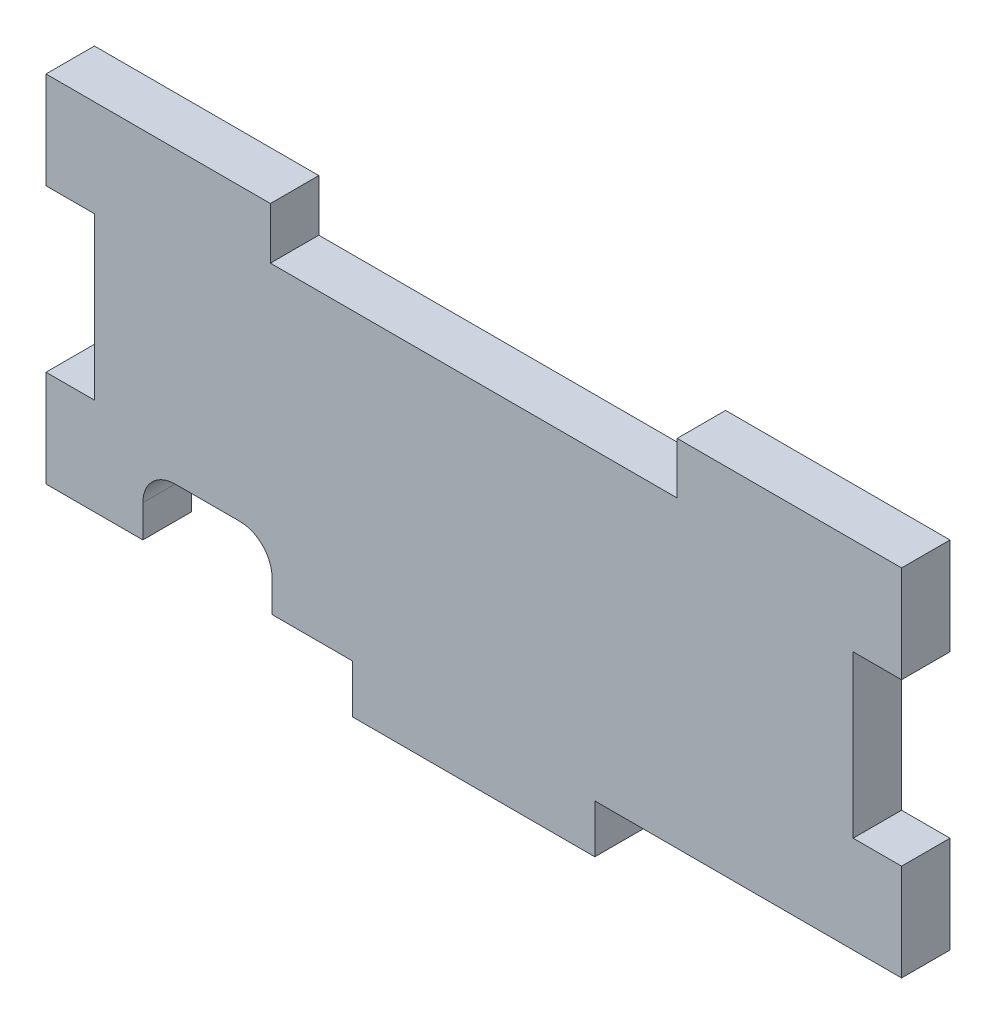
ISO-10303-21;
HEADER;
FILE_DESCRIPTION(('STEP AP214'),'2;1');
FILE_NAME('part.step','',(''),(''),'','','');
FILE_SCHEMA(('AUTOMOTIVE_DESIGN { 1 0 10303 214 1 1 1 1 }'));
ENDSEC;
DATA;
#1=APPLICATION_CONTEXT('core data for automotive mechanical design processes');
#2=APPLICATION_PROTOCOL_DEFINITION('international standard','automotive_design',2000,#1);
#3=PRODUCT_CONTEXT('',#1,'mechanical');
#4=PRODUCT('Part','Part','',(#3));
#5=PRODUCT_RELATED_PRODUCT_CATEGORY('part','',(#4));
#6=PRODUCT_DEFINITION_FORMATION('','',#4);
#7=PRODUCT_DEFINITION_CONTEXT('part definition',#1,'design');
#8=PRODUCT_DEFINITION('design','',#6,#7);
#9=PRODUCT_DEFINITION_SHAPE('','',#8);
#10=(LENGTH_UNIT() NAMED_UNIT(*) SI_UNIT(.MILLI.,.METRE.));
#11=(NAMED_UNIT(*) PLANE_ANGLE_UNIT() SI_UNIT($,.RADIAN.));
#12=(NAMED_UNIT(*) SI_UNIT($,.STERADIAN.) SOLID_ANGLE_UNIT());
#13=UNCERTAINTY_MEASURE_WITH_UNIT(LENGTH_MEASURE(1.E-05),#10,'distance_accuracy_value','');
#14=(GEOMETRIC_REPRESENTATION_CONTEXT(3) GLOBAL_UNCERTAINTY_ASSIGNED_CONTEXT((#13)) GLOBAL_UNIT_ASSIGNED_CONTEXT((#10,
#11,#12)) REPRESENTATION_CONTEXT('',''));
#15=CARTESIAN_POINT('',(0.,0.,0.));
#16=DIRECTION('',(0.,0.,1.));
#17=DIRECTION('',(1.,0.,0.));
#18=AXIS2_PLACEMENT_3D('',#15,#16,#17);
#19=CARTESIAN_POINT('',(-54.,11.,1.5));
#20=DIRECTION('',(0.,1.,0.));
#21=DIRECTION('',(-1.,0.,0.));
#22=AXIS2_PLACEMENT_3D('',#19,#20,#21);
#23=PLANE('',#22);
#24=DIRECTION('',(0.,0.,1.));
#25=VECTOR('',#24,1.);
#26=CARTESIAN_POINT('',(14.9,11.,-1.5));
#27=LINE('',#26,#25);
#28=CARTESIAN_POINT('',(14.9,11.,-1.5));
#29=VERTEX_POINT('',#28);
#30=CARTESIAN_POINT('',(14.9,11.,1.5));
#31=VERTEX_POINT('',#30);
#32=EDGE_CURVE('E237',#29,#31,#27,.T.);
#33=ORIENTED_EDGE('',*,*,#32,.F.);
#34=DIRECTION('',(1.,0.,0.));
#35=VECTOR('',#34,1.);
#36=CARTESIAN_POINT('',(-54.,11.,-1.5));
#37=LINE('',#36,#35);
#38=CARTESIAN_POINT('',(1.00000000000002,11.,-1.5));
#39=VERTEX_POINT('',#38);
#40=EDGE_CURVE('E228',#39,#29,#37,.T.);
#41=ORIENTED_EDGE('',*,*,#40,.F.);
#42=DIRECTION('',(0.,0.,1.));
#43=VECTOR('',#42,1.);
#44=CARTESIAN_POINT('',(1.00000000000002,11.,-1.5));
#45=LINE('',#44,#43);
#46=CARTESIAN_POINT('',(1.00000000000002,11.,1.5));
#47=VERTEX_POINT('',#46);
#48=EDGE_CURVE('E289',#39,#47,#45,.T.);
#49=ORIENTED_EDGE('',*,*,#48,.T.);
#50=DIRECTION('',(1.,0.,0.));
#51=VECTOR('',#50,1.);
#52=CARTESIAN_POINT('',(-54.,11.,1.5));
#53=LINE('',#52,#51);
#54=EDGE_CURVE('E368',#47,#31,#53,.T.);
#55=ORIENTED_EDGE('',*,*,#54,.T.);
#56=EDGE_LOOP('',(#33,#41,#49,#55));
#57=FACE_BOUND('',#56,.T.);
#58=ADVANCED_FACE('F33',(#57),#23,.T.);
#59=CARTESIAN_POINT('',(-20.,-11.,1.5));
#60=DIRECTION('',(0.,1.,0.));
#61=DIRECTION('',(-1.,0.,0.));
#62=AXIS2_PLACEMENT_3D('',#59,#60,#61);
#63=PLANE('',#62);
#64=DIRECTION('',(1.,0.,0.));
#65=VECTOR('',#64,1.);
#66=CARTESIAN_POINT('',(-20.,-11.,1.5));
#67=LINE('',#66,#65);
#68=CARTESIAN_POINT('',(15.,-11.,1.5));
#69=VERTEX_POINT('',#68);
#70=CARTESIAN_POINT('',(20.,-11.,1.5));
#71=VERTEX_POINT('',#70);
#72=EDGE_CURVE('E353',#69,#71,#67,.T.);
#73=ORIENTED_EDGE('',*,*,#72,.F.);
#74=DIRECTION('',(0.,0.,-1.));
#75=VECTOR('',#74,1.);
#76=CARTESIAN_POINT('',(15.,-11.,1.5));
#77=LINE('',#76,#75);
#78=CARTESIAN_POINT('',(15.,-11.,-1.5));
#79=VERTEX_POINT('',#78);
#80=EDGE_CURVE('E271',#69,#79,#77,.T.);
#81=ORIENTED_EDGE('',*,*,#80,.T.);
#82=DIRECTION('',(1.,0.,0.));
#83=VECTOR('',#82,1.);
#84=CARTESIAN_POINT('',(-20.,-11.,-1.5));
#85=LINE('',#84,#83);
#86=CARTESIAN_POINT('',(20.,-11.,-1.5));
#87=VERTEX_POINT('',#86);
#88=EDGE_CURVE('E342',#79,#87,#85,.T.);
#89=ORIENTED_EDGE('',*,*,#88,.T.);
#90=DIRECTION('',(0.,0.,-1.));
#91=VECTOR('',#90,1.);
#92=CARTESIAN_POINT('',(20.,-11.,1.5));
#93=LINE('',#92,#91);
#94=EDGE_CURVE('E11',#71,#87,#93,.T.);
#95=ORIENTED_EDGE('',*,*,#94,.F.);
#96=EDGE_LOOP('',(#73,#81,#89,#95));
#97=FACE_BOUND('',#96,.T.);
#98=ADVANCED_FACE('F425',(#97),#63,.F.);
#99=CARTESIAN_POINT('',(54.,11.,1.5));
#100=DIRECTION('',(1.,0.,0.));
#101=DIRECTION('',(0.,0.,-1.));
#102=AXIS2_PLACEMENT_3D('',#99,#100,#101);
#103=PLANE('',#102);
#104=DIRECTION('',(0.,0.,1.));
#105=VECTOR('',#104,1.);
#106=CARTESIAN_POINT('',(54.,5.,-1.5));
#107=LINE('',#106,#105);
#108=CARTESIAN_POINT('',(54.,5.,-1.5));
#109=VERTEX_POINT('',#108);
#110=CARTESIAN_POINT('',(54.,5.,1.5));
#111=VERTEX_POINT('',#110);
#112=EDGE_CURVE('E316',#109,#111,#107,.T.);
#113=ORIENTED_EDGE('',*,*,#112,.F.);
#114=DIRECTION('',(0.,-1.,0.));
#115=VECTOR('',#114,1.);
#116=CARTESIAN_POINT('',(54.,11.,-1.5));
#117=LINE('',#116,#115);
#118=CARTESIAN_POINT('',(54.,11.,-1.5));
#119=VERTEX_POINT('',#118);
#120=EDGE_CURVE('E387',#119,#109,#117,.T.);
#121=ORIENTED_EDGE('',*,*,#120,.F.);
#122=DIRECTION('',(0.,0.,-1.));
#123=VECTOR('',#122,1.);
#124=CARTESIAN_POINT('',(54.,11.,1.5));
#125=LINE('',#124,#123);
#126=CARTESIAN_POINT('',(54.,11.,1.5));
#127=VERTEX_POINT('',#126);
#128=EDGE_CURVE('E371',#127,#119,#125,.T.);
#129=ORIENTED_EDGE('',*,*,#128,.F.);
#130=DIRECTION('',(0.,-1.,0.));
#131=VECTOR('',#130,1.);
#132=CARTESIAN_POINT('',(54.,11.,1.5));
#133=LINE('',#132,#131);
#134=EDGE_CURVE('E364',#127,#111,#133,.T.);
#135=ORIENTED_EDGE('',*,*,#134,.T.);
#136=EDGE_LOOP('',(#113,#121,#129,#135));
#137=FACE_BOUND('',#136,.T.);
#138=ADVANCED_FACE('F461',(#137),#103,.T.);
#139=CARTESIAN_POINT('',(1.00000000000002,-11.,-1.5));
#140=VERTEX_POINT('',#139);
#141=CARTESIAN_POINT('',(7.,-11.,-1.5));
#142=VERTEX_POINT('',#141);
#143=EDGE_CURVE('E372',#140,#142,#85,.T.);
#144=ORIENTED_EDGE('',*,*,#143,.T.);
#145=DIRECTION('',(0.,0.,-1.));
#146=VECTOR('',#145,1.);
#147=CARTESIAN_POINT('',(7.,-11.,1.5));
#148=LINE('',#147,#146);
#149=CARTESIAN_POINT('',(7.,-11.,1.5));
#150=VERTEX_POINT('',#149);
#151=EDGE_CURVE('E56',#150,#142,#148,.T.);
#152=ORIENTED_EDGE('',*,*,#151,.F.);
#153=CARTESIAN_POINT('',(1.00000000000002,-11.,1.5));
#154=VERTEX_POINT('',#153);
#155=EDGE_CURVE('E349',#154,#150,#67,.T.);
#156=ORIENTED_EDGE('',*,*,#155,.F.);
#157=DIRECTION('',(0.,0.,-1.));
#158=VECTOR('',#157,1.);
#159=CARTESIAN_POINT('',(1.00000000000002,-11.,1.5));
#160=LINE('',#159,#158);
#161=EDGE_CURVE('E292',#154,#140,#160,.T.);
#162=ORIENTED_EDGE('',*,*,#161,.T.);
#163=EDGE_LOOP('',(#144,#152,#156,#162));
#164=FACE_BOUND('',#163,.T.);
#165=ADVANCED_FACE('F35',(#164),#63,.F.);
#166=CARTESIAN_POINT('',(20.,-11.,1.5));
#167=DIRECTION('',(1.,0.,0.));
#168=DIRECTION('',(0.,1.,0.));
#169=AXIS2_PLACEMENT_3D('',#166,#167,#168);
#170=PLANE('',#169);
#171=DIRECTION('',(0.,-1.,0.));
#172=VECTOR('',#171,1.);
#173=CARTESIAN_POINT('',(20.,-11.,-1.5));
#174=LINE('',#173,#172);
#175=CARTESIAN_POINT('',(20.,-14.,-1.5));
#176=VERTEX_POINT('',#175);
#177=EDGE_CURVE('E375',#87,#176,#174,.T.);
#178=ORIENTED_EDGE('',*,*,#177,.T.);
#179=DIRECTION('',(0.,0.,-1.));
#180=VECTOR('',#179,1.);
#181=CARTESIAN_POINT('',(20.,-14.,1.5));
#182=LINE('',#181,#180);
#183=CARTESIAN_POINT('',(20.,-14.,1.5));
#184=VERTEX_POINT('',#183);
#185=EDGE_CURVE('E41',#184,#176,#182,.T.);
#186=ORIENTED_EDGE('',*,*,#185,.F.);
#187=DIRECTION('',(0.,-1.,0.));
#188=VECTOR('',#187,1.);
#189=CARTESIAN_POINT('',(20.,-11.,1.5));
#190=LINE('',#189,#188);
#191=EDGE_CURVE('E352',#71,#184,#190,.T.);
#192=ORIENTED_EDGE('',*,*,#191,.F.);
#193=ORIENTED_EDGE('',*,*,#94,.T.);
#194=EDGE_LOOP('',(#178,#186,#192,#193));
#195=FACE_BOUND('',#194,.T.);
#196=ADVANCED_FACE('F423',(#195),#170,.F.);
#197=CARTESIAN_POINT('',(20.,-14.,1.5));
#198=DIRECTION('',(0.,1.,0.));
#199=DIRECTION('',(-1.,0.,0.));
#200=AXIS2_PLACEMENT_3D('',#197,#198,#199);
#201=PLANE('',#200);
#202=DIRECTION('',(1.,0.,0.));
#203=VECTOR('',#202,1.);
#204=CARTESIAN_POINT('',(20.,-14.,-1.5));
#205=LINE('',#204,#203);
#206=CARTESIAN_POINT('',(35.,-14.,-1.5));
#207=VERTEX_POINT('',#206);
#208=EDGE_CURVE('E377',#176,#207,#205,.T.);
#209=ORIENTED_EDGE('',*,*,#208,.T.);
#210=DIRECTION('',(0.,0.,-1.));
#211=VECTOR('',#210,1.);
#212=CARTESIAN_POINT('',(35.,-14.,1.5));
#213=LINE('',#212,#211);
#214=CARTESIAN_POINT('',(35.,-14.,1.5));
#215=VERTEX_POINT('',#214);
#216=EDGE_CURVE('E399',#215,#207,#213,.T.);
#217=ORIENTED_EDGE('',*,*,#216,.F.);
#218=DIRECTION('',(1.,0.,0.));
#219=VECTOR('',#218,1.);
#220=CARTESIAN_POINT('',(20.,-14.,1.5));
#221=LINE('',#220,#219);
#222=EDGE_CURVE('E355',#184,#215,#221,.T.);
#223=ORIENTED_EDGE('',*,*,#222,.F.);
#224=ORIENTED_EDGE('',*,*,#185,.T.);
#225=EDGE_LOOP('',(#209,#217,#223,#224));
#226=FACE_BOUND('',#225,.T.);
#227=ADVANCED_FACE('F405',(#226),#201,.F.);
#228=CARTESIAN_POINT('',(35.,-11.,1.5));
#229=DIRECTION('',(1.,0.,0.));
#230=DIRECTION('',(0.,0.,-1.));
#231=AXIS2_PLACEMENT_3D('',#228,#229,#230);
#232=PLANE('',#231);
#233=DIRECTION('',(0.,-1.,0.));
#234=VECTOR('',#233,1.);
#235=CARTESIAN_POINT('',(35.,-11.,-1.5));
#236=LINE('',#235,#234);
#237=CARTESIAN_POINT('',(35.,-11.,-1.5));
#238=VERTEX_POINT('',#237);
#239=EDGE_CURVE('E380',#238,#207,#236,.T.);
#240=ORIENTED_EDGE('',*,*,#239,.F.);
#241=DIRECTION('',(0.,0.,-1.));
#242=VECTOR('',#241,1.);
#243=CARTESIAN_POINT('',(35.,-11.,1.5));
#244=LINE('',#243,#242);
#245=CARTESIAN_POINT('',(35.,-11.,1.5));
#246=VERTEX_POINT('',#245);
#247=EDGE_CURVE('E397',#246,#238,#244,.T.);
#248=ORIENTED_EDGE('',*,*,#247,.F.);
#249=DIRECTION('',(0.,-1.,0.));
#250=VECTOR('',#249,1.);
#251=CARTESIAN_POINT('',(35.,-11.,1.5));
#252=LINE('',#251,#250);
#253=EDGE_CURVE('E357',#246,#215,#252,.T.);
#254=ORIENTED_EDGE('',*,*,#253,.T.);
#255=ORIENTED_EDGE('',*,*,#216,.T.);
#256=EDGE_LOOP('',(#240,#248,#254,#255));
#257=FACE_BOUND('',#256,.T.);
#258=ADVANCED_FACE('F414',(#257),#232,.T.);
#259=CARTESIAN_POINT('',(35.,-11.,1.5));
#260=DIRECTION('',(0.,1.,0.));
#261=DIRECTION('',(-1.,0.,0.));
#262=AXIS2_PLACEMENT_3D('',#259,#260,#261);
#263=PLANE('',#262);
#264=DIRECTION('',(1.,0.,0.));
#265=VECTOR('',#264,1.);
#266=CARTESIAN_POINT('',(35.,-11.,-1.5));
#267=LINE('',#266,#265);
#268=CARTESIAN_POINT('',(54.,-11.,-1.5));
#269=VERTEX_POINT('',#268);
#270=EDGE_CURVE('E383',#238,#269,#267,.T.);
#271=ORIENTED_EDGE('',*,*,#270,.T.);
#272=DIRECTION('',(0.,0.,-1.));
#273=VECTOR('',#272,1.);
#274=CARTESIAN_POINT('',(54.,-11.,1.5));
#275=LINE('',#274,#273);
#276=CARTESIAN_POINT('',(54.,-11.,1.5));
#277=VERTEX_POINT('',#276);
#278=EDGE_CURVE('E394',#277,#269,#275,.T.);
#279=ORIENTED_EDGE('',*,*,#278,.F.);
#280=DIRECTION('',(1.,0.,0.));
#281=VECTOR('',#280,1.);
#282=CARTESIAN_POINT('',(35.,-11.,1.5));
#283=LINE('',#282,#281);
#284=EDGE_CURVE('E360',#246,#277,#283,.T.);
#285=ORIENTED_EDGE('',*,*,#284,.F.);
#286=ORIENTED_EDGE('',*,*,#247,.T.);
#287=EDGE_LOOP('',(#271,#279,#285,#286));
#288=FACE_BOUND('',#287,.T.);
#289=ADVANCED_FACE('F472',(#288),#263,.F.);
#290=DIRECTION('',(0.,0.,1.));
#291=VECTOR('',#290,1.);
#292=CARTESIAN_POINT('',(54.,-5.,-1.5));
#293=LINE('',#292,#291);
#294=CARTESIAN_POINT('',(54.,-5.,-1.5));
#295=VERTEX_POINT('',#294);
#296=CARTESIAN_POINT('',(54.,-5.,1.5));
#297=VERTEX_POINT('',#296);
#298=EDGE_CURVE('E318',#295,#297,#293,.T.);
#299=ORIENTED_EDGE('',*,*,#298,.T.);
#300=EDGE_CURVE('E363',#297,#277,#133,.T.);
#301=ORIENTED_EDGE('',*,*,#300,.T.);
#302=ORIENTED_EDGE('',*,*,#278,.T.);
#303=EDGE_CURVE('E386',#295,#269,#117,.T.);
#304=ORIENTED_EDGE('',*,*,#303,.F.);
#305=EDGE_LOOP('',(#299,#301,#302,#304));
#306=FACE_BOUND('',#305,.T.);
#307=ADVANCED_FACE('F465',(#306),#103,.T.);
#308=DIRECTION('',(0.,0.,1.));
#309=VECTOR('',#308,1.);
#310=CARTESIAN_POINT('',(40.1,11.,-1.5));
#311=LINE('',#310,#309);
#312=CARTESIAN_POINT('',(40.1,11.,-1.5));
#313=VERTEX_POINT('',#312);
#314=CARTESIAN_POINT('',(40.1,11.,1.5));
#315=VERTEX_POINT('',#314);
#316=EDGE_CURVE('E240',#313,#315,#311,.T.);
#317=ORIENTED_EDGE('',*,*,#316,.T.);
#318=EDGE_CURVE('E367',#315,#127,#53,.T.);
#319=ORIENTED_EDGE('',*,*,#318,.T.);
#320=ORIENTED_EDGE('',*,*,#128,.T.);
#321=EDGE_CURVE('E390',#313,#119,#37,.T.);
#322=ORIENTED_EDGE('',*,*,#321,.F.);
#323=EDGE_LOOP('',(#317,#319,#320,#322));
#324=FACE_BOUND('',#323,.T.);
#325=ADVANCED_FACE('F457',(#324),#23,.T.);
#326=CARTESIAN_POINT('',(0.,0.,1.5));
#327=DIRECTION('',(0.,0.,1.));
#328=DIRECTION('',(1.,0.,0.));
#329=AXIS2_PLACEMENT_3D('',#326,#327,#328);
#330=PLANE('',#329);
#331=DIRECTION('',(0.,-1.,0.));
#332=VECTOR('',#331,1.);
#333=CARTESIAN_POINT('',(14.9,11.,1.5));
#334=LINE('',#333,#332);
#335=CARTESIAN_POINT('',(14.9,7.80000000000002,1.5));
#336=VERTEX_POINT('',#335);
#337=EDGE_CURVE('E213',#31,#336,#334,.T.);
#338=ORIENTED_EDGE('',*,*,#337,.F.);
#339=ORIENTED_EDGE('',*,*,#54,.F.);
#340=DIRECTION('',(0.,1.,0.));
#341=VECTOR('',#340,1.);
#342=CARTESIAN_POINT('',(1.00000000000002,11.,1.5));
#343=LINE('',#342,#341);
#344=CARTESIAN_POINT('',(1.00000000000002,5.,1.5));
#345=VERTEX_POINT('',#344);
#346=EDGE_CURVE('E274',#345,#47,#343,.T.);
#347=ORIENTED_EDGE('',*,*,#346,.F.);
#348=DIRECTION('',(-1.,0.,0.));
#349=VECTOR('',#348,1.);
#350=CARTESIAN_POINT('',(1.00000000000002,4.99999999999999,1.5));
#351=LINE('',#350,#349);
#352=CARTESIAN_POINT('',(4.00000000000002,4.99999999999999,1.5));
#353=VERTEX_POINT('',#352);
#354=EDGE_CURVE('E326',#353,#345,#351,.T.);
#355=ORIENTED_EDGE('',*,*,#354,.F.);
#356=DIRECTION('',(0.,1.,0.));
#357=VECTOR('',#356,1.);
#358=CARTESIAN_POINT('',(4.00000000000002,4.99999999999999,1.5));
#359=LINE('',#358,#357);
#360=CARTESIAN_POINT('',(4.00000000000002,-5.00000000000001,1.5));
#361=VERTEX_POINT('',#360);
#362=EDGE_CURVE('E335',#361,#353,#359,.T.);
#363=ORIENTED_EDGE('',*,*,#362,.F.);
#364=DIRECTION('',(1.,0.,0.));
#365=VECTOR('',#364,1.);
#366=CARTESIAN_POINT('',(1.00000000000003,-5.00000000000001,1.5));
#367=LINE('',#366,#365);
#368=CARTESIAN_POINT('',(1.00000000000003,-5.00000000000001,1.5));
#369=VERTEX_POINT('',#368);
#370=EDGE_CURVE('E315',#369,#361,#367,.T.);
#371=ORIENTED_EDGE('',*,*,#370,.F.);
#372=EDGE_CURVE('E287',#154,#369,#343,.T.);
#373=ORIENTED_EDGE('',*,*,#372,.F.);
#374=ORIENTED_EDGE('',*,*,#155,.T.);
#375=DIRECTION('',(0.,1.,0.));
#376=VECTOR('',#375,1.);
#377=CARTESIAN_POINT('',(7.,-11.,1.5));
#378=LINE('',#377,#376);
#379=CARTESIAN_POINT('',(7.,-8.99999999999998,1.5));
#380=VERTEX_POINT('',#379);
#381=EDGE_CURVE('E244',#150,#380,#378,.T.);
#382=ORIENTED_EDGE('',*,*,#381,.T.);
#383=CARTESIAN_POINT('',(9.,-8.99999999999998,1.5));
#384=DIRECTION('',(0.,0.,-1.));
#385=DIRECTION('',(1.,0.,0.));
#386=AXIS2_PLACEMENT_3D('',#383,#384,#385);
#387=CIRCLE('',#386,2.);
#388=CARTESIAN_POINT('',(9.,-6.99999999999998,1.5));
#389=VERTEX_POINT('',#388);
#390=EDGE_CURVE('E247',#380,#389,#387,.T.);
#391=ORIENTED_EDGE('',*,*,#390,.T.);
#392=DIRECTION('',(1.,0.,0.));
#393=VECTOR('',#392,1.);
#394=CARTESIAN_POINT('',(9.,-6.99999999999998,1.5));
#395=LINE('',#394,#393);
#396=CARTESIAN_POINT('',(13.,-6.99999999999998,1.5));
#397=VERTEX_POINT('',#396);
#398=EDGE_CURVE('E251',#389,#397,#395,.T.);
#399=ORIENTED_EDGE('',*,*,#398,.T.);
#400=CARTESIAN_POINT('',(13.,-8.99999999999998,1.5));
#401=DIRECTION('',(0.,0.,-1.));
#402=DIRECTION('',(1.,0.,0.));
#403=AXIS2_PLACEMENT_3D('',#400,#401,#402);
#404=CIRCLE('',#403,2.);
#405=CARTESIAN_POINT('',(15.,-8.99999999999998,1.5));
#406=VERTEX_POINT('',#405);
#407=EDGE_CURVE('E254',#397,#406,#404,.T.);
#408=ORIENTED_EDGE('',*,*,#407,.T.);
#409=DIRECTION('',(0.,-1.,0.));
#410=VECTOR('',#409,1.);
#411=CARTESIAN_POINT('',(15.,-8.99999999999998,1.5));
#412=LINE('',#411,#410);
#413=EDGE_CURVE('E257',#406,#69,#412,.T.);
#414=ORIENTED_EDGE('',*,*,#413,.T.);
#415=ORIENTED_EDGE('',*,*,#72,.T.);
#416=ORIENTED_EDGE('',*,*,#191,.T.);
#417=ORIENTED_EDGE('',*,*,#222,.T.);
#418=ORIENTED_EDGE('',*,*,#253,.F.);
#419=ORIENTED_EDGE('',*,*,#284,.T.);
#420=ORIENTED_EDGE('',*,*,#300,.F.);
#421=DIRECTION('',(1.,0.,0.));
#422=VECTOR('',#421,1.);
#423=CARTESIAN_POINT('',(51.,-5.00000000000001,1.5));
#424=LINE('',#423,#422);
#425=CARTESIAN_POINT('',(51.,-5.00000000000001,1.5));
#426=VERTEX_POINT('',#425);
#427=EDGE_CURVE('E309',#426,#297,#424,.T.);
#428=ORIENTED_EDGE('',*,*,#427,.F.);
#429=DIRECTION('',(0.,-1.,0.));
#430=VECTOR('',#429,1.);
#431=CARTESIAN_POINT('',(51.,4.99999999999999,1.5));
#432=LINE('',#431,#430);
#433=CARTESIAN_POINT('',(51.,4.99999999999999,1.5));
#434=VERTEX_POINT('',#433);
#435=EDGE_CURVE('E295',#434,#426,#432,.T.);
#436=ORIENTED_EDGE('',*,*,#435,.F.);
#437=DIRECTION('',(-1.,0.,0.));
#438=VECTOR('',#437,1.);
#439=CARTESIAN_POINT('',(51.,4.99999999999999,1.5));
#440=LINE('',#439,#438);
#441=EDGE_CURVE('E300',#111,#434,#440,.T.);
#442=ORIENTED_EDGE('',*,*,#441,.F.);
#443=ORIENTED_EDGE('',*,*,#134,.F.);
#444=ORIENTED_EDGE('',*,*,#318,.F.);
#445=DIRECTION('',(0.,1.,0.));
#446=VECTOR('',#445,1.);
#447=CARTESIAN_POINT('',(40.1,11.,1.5));
#448=LINE('',#447,#446);
#449=CARTESIAN_POINT('',(40.1,7.80000000000002,1.5));
#450=VERTEX_POINT('',#449);
#451=EDGE_CURVE('E229',#450,#315,#448,.T.);
#452=ORIENTED_EDGE('',*,*,#451,.F.);
#453=DIRECTION('',(1.,0.,0.));
#454=VECTOR('',#453,1.);
#455=CARTESIAN_POINT('',(14.9,7.80000000000002,1.5));
#456=LINE('',#455,#454);
#457=EDGE_CURVE('E231',#336,#450,#456,.T.);
#458=ORIENTED_EDGE('',*,*,#457,.F.);
#459=EDGE_LOOP('',(#338,#339,#347,#355,#363,#371,#373,#374,#382,#391,#399,#408,#414,#415,#416,
#417,#418,#419,#420,#428,#436,#442,#443,#444,#452,#458));
#460=FACE_BOUND('',#459,.T.);
#461=ADVANCED_FACE('F418',(#460),#330,.T.);
#462=CARTESIAN_POINT('',(0.,0.,-1.5));
#463=DIRECTION('',(0.,0.,1.));
#464=DIRECTION('',(1.,0.,0.));
#465=AXIS2_PLACEMENT_3D('',#462,#463,#464);
#466=PLANE('',#465);
#467=ORIENTED_EDGE('',*,*,#40,.T.);
#468=DIRECTION('',(0.,-1.,0.));
#469=VECTOR('',#468,1.);
#470=CARTESIAN_POINT('',(14.9,11.,-1.5));
#471=LINE('',#470,#469);
#472=CARTESIAN_POINT('',(14.9,7.80000000000002,-1.5));
#473=VERTEX_POINT('',#472);
#474=EDGE_CURVE('E210',#29,#473,#471,.T.);
#475=ORIENTED_EDGE('',*,*,#474,.T.);
#476=DIRECTION('',(1.,0.,0.));
#477=VECTOR('',#476,1.);
#478=CARTESIAN_POINT('',(14.9,7.80000000000002,-1.5));
#479=LINE('',#478,#477);
#480=CARTESIAN_POINT('',(40.1,7.80000000000002,-1.5));
#481=VERTEX_POINT('',#480);
#482=EDGE_CURVE('E220',#473,#481,#479,.T.);
#483=ORIENTED_EDGE('',*,*,#482,.T.);
#484=DIRECTION('',(0.,1.,0.));
#485=VECTOR('',#484,1.);
#486=CARTESIAN_POINT('',(40.1,11.,-1.5));
#487=LINE('',#486,#485);
#488=EDGE_CURVE('E48',#481,#313,#487,.T.);
#489=ORIENTED_EDGE('',*,*,#488,.T.);
#490=ORIENTED_EDGE('',*,*,#321,.T.);
#491=ORIENTED_EDGE('',*,*,#120,.T.);
#492=DIRECTION('',(-1.,0.,0.));
#493=VECTOR('',#492,1.);
#494=CARTESIAN_POINT('',(51.,4.99999999999999,-1.5));
#495=LINE('',#494,#493);
#496=CARTESIAN_POINT('',(51.,4.99999999999999,-1.5));
#497=VERTEX_POINT('',#496);
#498=EDGE_CURVE('E303',#109,#497,#495,.T.);
#499=ORIENTED_EDGE('',*,*,#498,.T.);
#500=DIRECTION('',(0.,-1.,0.));
#501=VECTOR('',#500,1.);
#502=CARTESIAN_POINT('',(51.,4.99999999999999,-1.5));
#503=LINE('',#502,#501);
#504=CARTESIAN_POINT('',(51.,-5.00000000000001,-1.5));
#505=VERTEX_POINT('',#504);
#506=EDGE_CURVE('E296',#497,#505,#503,.T.);
#507=ORIENTED_EDGE('',*,*,#506,.T.);
#508=DIRECTION('',(1.,0.,0.));
#509=VECTOR('',#508,1.);
#510=CARTESIAN_POINT('',(51.,-5.00000000000001,-1.5));
#511=LINE('',#510,#509);
#512=EDGE_CURVE('E299',#505,#295,#511,.T.);
#513=ORIENTED_EDGE('',*,*,#512,.T.);
#514=ORIENTED_EDGE('',*,*,#303,.T.);
#515=ORIENTED_EDGE('',*,*,#270,.F.);
#516=ORIENTED_EDGE('',*,*,#239,.T.);
#517=ORIENTED_EDGE('',*,*,#208,.F.);
#518=ORIENTED_EDGE('',*,*,#177,.F.);
#519=ORIENTED_EDGE('',*,*,#88,.F.);
#520=DIRECTION('',(0.,-1.,0.));
#521=VECTOR('',#520,1.);
#522=CARTESIAN_POINT('',(15.,-8.99999999999998,-1.5));
#523=LINE('',#522,#521);
#524=CARTESIAN_POINT('',(15.,-8.99999999999998,-1.5));
#525=VERTEX_POINT('',#524);
#526=EDGE_CURVE('E248',#525,#79,#523,.T.);
#527=ORIENTED_EDGE('',*,*,#526,.F.);
#528=CARTESIAN_POINT('',(13.,-8.99999999999998,-1.5));
#529=DIRECTION('',(0.,0.,-1.));
#530=DIRECTION('',(1.,0.,0.));
#531=AXIS2_PLACEMENT_3D('',#528,#529,#530);
#532=CIRCLE('',#531,2.);
#533=CARTESIAN_POINT('',(13.,-6.99999999999998,-1.5));
#534=VERTEX_POINT('',#533);
#535=EDGE_CURVE('E267',#534,#525,#532,.T.);
#536=ORIENTED_EDGE('',*,*,#535,.F.);
#537=DIRECTION('',(1.,0.,0.));
#538=VECTOR('',#537,1.);
#539=CARTESIAN_POINT('',(9.,-6.99999999999998,-1.5));
#540=LINE('',#539,#538);
#541=CARTESIAN_POINT('',(9.,-6.99999999999998,-1.5));
#542=VERTEX_POINT('',#541);
#543=EDGE_CURVE('E264',#542,#534,#540,.T.);
#544=ORIENTED_EDGE('',*,*,#543,.F.);
#545=CARTESIAN_POINT('',(9.,-8.99999999999998,-1.5));
#546=DIRECTION('',(0.,0.,-1.));
#547=DIRECTION('',(1.,0.,0.));
#548=AXIS2_PLACEMENT_3D('',#545,#546,#547);
#549=CIRCLE('',#548,2.);
#550=CARTESIAN_POINT('',(7.,-8.99999999999998,-1.5));
#551=VERTEX_POINT('',#550);
#552=EDGE_CURVE('E261',#551,#542,#549,.T.);
#553=ORIENTED_EDGE('',*,*,#552,.F.);
#554=DIRECTION('',(0.,1.,0.));
#555=VECTOR('',#554,1.);
#556=CARTESIAN_POINT('',(7.,-11.,-1.5));
#557=LINE('',#556,#555);
#558=EDGE_CURVE('E239',#142,#551,#557,.T.);
#559=ORIENTED_EDGE('',*,*,#558,.F.);
#560=ORIENTED_EDGE('',*,*,#143,.F.);
#561=DIRECTION('',(0.,1.,0.));
#562=VECTOR('',#561,1.);
#563=CARTESIAN_POINT('',(1.00000000000002,11.,-1.5));
#564=LINE('',#563,#562);
#565=CARTESIAN_POINT('',(1.00000000000002,-5.,-1.5));
#566=VERTEX_POINT('',#565);
#567=EDGE_CURVE('E286',#140,#566,#564,.T.);
#568=ORIENTED_EDGE('',*,*,#567,.T.);
#569=DIRECTION('',(1.,0.,0.));
#570=VECTOR('',#569,1.);
#571=CARTESIAN_POINT('',(1.00000000000003,-5.00000000000001,-1.5));
#572=LINE('',#571,#570);
#573=CARTESIAN_POINT('',(4.00000000000002,-5.00000000000001,-1.5));
#574=VERTEX_POINT('',#573);
#575=EDGE_CURVE('E322',#566,#574,#572,.T.);
#576=ORIENTED_EDGE('',*,*,#575,.T.);
#577=DIRECTION('',(0.,1.,0.));
#578=VECTOR('',#577,1.);
#579=CARTESIAN_POINT('',(4.00000000000002,4.99999999999999,-1.5));
#580=LINE('',#579,#578);
#581=CARTESIAN_POINT('',(4.00000000000002,4.99999999999999,-1.5));
#582=VERTEX_POINT('',#581);
#583=EDGE_CURVE('E325',#574,#582,#580,.T.);
#584=ORIENTED_EDGE('',*,*,#583,.T.);
#585=DIRECTION('',(-1.,0.,0.));
#586=VECTOR('',#585,1.);
#587=CARTESIAN_POINT('',(1.00000000000002,4.99999999999999,-1.5));
#588=LINE('',#587,#586);
#589=CARTESIAN_POINT('',(1.00000000000002,4.99999999999999,-1.5));
#590=VERTEX_POINT('',#589);
#591=EDGE_CURVE('E329',#582,#590,#588,.T.);
#592=ORIENTED_EDGE('',*,*,#591,.T.);
#593=EDGE_CURVE('E284',#590,#39,#564,.T.);
#594=ORIENTED_EDGE('',*,*,#593,.T.);
#595=EDGE_LOOP('',(#467,#475,#483,#489,#490,#491,#499,#507,#513,#514,#515,#516,#517,#518,#519,
#527,#536,#544,#553,#559,#560,#568,#576,#584,#592,#594));
#596=FACE_BOUND('',#595,.T.);
#597=ADVANCED_FACE('F225',(#596),#466,.F.);
#598=CARTESIAN_POINT('',(1.00000000000002,4.99999999999999,-1.5));
#599=DIRECTION('',(0.,1.,0.));
#600=DIRECTION('',(0.,0.,1.));
#601=AXIS2_PLACEMENT_3D('',#598,#599,#600);
#602=PLANE('',#601);
#603=ORIENTED_EDGE('',*,*,#354,.T.);
#604=DIRECTION('',(0.,0.,1.));
#605=VECTOR('',#604,1.);
#606=CARTESIAN_POINT('',(1.00000000000002,4.99999999999999,-1.5));
#607=LINE('',#606,#605);
#608=EDGE_CURVE('E340',#590,#345,#607,.T.);
#609=ORIENTED_EDGE('',*,*,#608,.F.);
#610=ORIENTED_EDGE('',*,*,#591,.F.);
#611=DIRECTION('',(0.,0.,1.));
#612=VECTOR('',#611,1.);
#613=CARTESIAN_POINT('',(4.00000000000002,4.99999999999999,-1.5));
#614=LINE('',#613,#612);
#615=EDGE_CURVE('E343',#582,#353,#614,.T.);
#616=ORIENTED_EDGE('',*,*,#615,.T.);
#617=EDGE_LOOP('',(#603,#609,#610,#616));
#618=FACE_BOUND('',#617,.T.);
#619=ADVANCED_FACE('F526',(#618),#602,.F.);
#620=CARTESIAN_POINT('',(4.00000000000002,4.99999999999999,-1.5));
#621=DIRECTION('',(1.,0.,0.));
#622=DIRECTION('',(0.,0.,-1.));
#623=AXIS2_PLACEMENT_3D('',#620,#621,#622);
#624=PLANE('',#623);
#625=ORIENTED_EDGE('',*,*,#362,.T.);
#626=ORIENTED_EDGE('',*,*,#615,.F.);
#627=ORIENTED_EDGE('',*,*,#583,.F.);
#628=DIRECTION('',(0.,0.,1.));
#629=VECTOR('',#628,1.);
#630=CARTESIAN_POINT('',(4.00000000000002,-5.00000000000001,-1.5));
#631=LINE('',#630,#629);
#632=EDGE_CURVE('E345',#574,#361,#631,.T.);
#633=ORIENTED_EDGE('',*,*,#632,.T.);
#634=EDGE_LOOP('',(#625,#626,#627,#633));
#635=FACE_BOUND('',#634,.T.);
#636=ADVANCED_FACE('F521',(#635),#624,.F.);
#637=CARTESIAN_POINT('',(1.00000000000003,-5.00000000000001,-1.5));
#638=DIRECTION('',(0.,-1.,0.));
#639=DIRECTION('',(0.,0.,-1.));
#640=AXIS2_PLACEMENT_3D('',#637,#638,#639);
#641=PLANE('',#640);
#642=ORIENTED_EDGE('',*,*,#370,.T.);
#643=ORIENTED_EDGE('',*,*,#632,.F.);
#644=ORIENTED_EDGE('',*,*,#575,.F.);
#645=DIRECTION('',(0.,0.,1.));
#646=VECTOR('',#645,1.);
#647=CARTESIAN_POINT('',(1.00000000000003,-5.00000000000001,-1.5));
#648=LINE('',#647,#646);
#649=EDGE_CURVE('E332',#566,#369,#648,.T.);
#650=ORIENTED_EDGE('',*,*,#649,.T.);
#651=EDGE_LOOP('',(#642,#643,#644,#650));
#652=FACE_BOUND('',#651,.T.);
#653=ADVANCED_FACE('F517',(#652),#641,.F.);
#654=CARTESIAN_POINT('',(51.,4.99999999999999,-1.5));
#655=DIRECTION('',(-1.,0.,0.));
#656=DIRECTION('',(0.,0.,1.));
#657=AXIS2_PLACEMENT_3D('',#654,#655,#656);
#658=PLANE('',#657);
#659=ORIENTED_EDGE('',*,*,#435,.T.);
#660=DIRECTION('',(0.,0.,1.));
#661=VECTOR('',#660,1.);
#662=CARTESIAN_POINT('',(51.,-5.00000000000001,-1.5));
#663=LINE('',#662,#661);
#664=EDGE_CURVE('E306',#505,#426,#663,.T.);
#665=ORIENTED_EDGE('',*,*,#664,.F.);
#666=ORIENTED_EDGE('',*,*,#506,.F.);
#667=DIRECTION('',(0.,0.,1.));
#668=VECTOR('',#667,1.);
#669=CARTESIAN_POINT('',(51.,4.99999999999999,-1.5));
#670=LINE('',#669,#668);
#671=EDGE_CURVE('E313',#497,#434,#670,.T.);
#672=ORIENTED_EDGE('',*,*,#671,.T.);
#673=EDGE_LOOP('',(#659,#665,#666,#672));
#674=FACE_BOUND('',#673,.T.);
#675=ADVANCED_FACE('F488',(#674),#658,.F.);
#676=CARTESIAN_POINT('',(51.,4.99999999999999,-1.5));
#677=DIRECTION('',(0.,1.,0.));
#678=DIRECTION('',(-1.,0.,0.));
#679=AXIS2_PLACEMENT_3D('',#676,#677,#678);
#680=PLANE('',#679);
#681=ORIENTED_EDGE('',*,*,#441,.T.);
#682=ORIENTED_EDGE('',*,*,#671,.F.);
#683=ORIENTED_EDGE('',*,*,#498,.F.);
#684=ORIENTED_EDGE('',*,*,#112,.T.);
#685=EDGE_LOOP('',(#681,#682,#683,#684));
#686=FACE_BOUND('',#685,.T.);
#687=ADVANCED_FACE('F486',(#686),#680,.F.);
#688=CARTESIAN_POINT('',(51.,-5.00000000000001,-1.5));
#689=DIRECTION('',(0.,-1.,0.));
#690=DIRECTION('',(1.,0.,0.));
#691=AXIS2_PLACEMENT_3D('',#688,#689,#690);
#692=PLANE('',#691);
#693=ORIENTED_EDGE('',*,*,#427,.T.);
#694=ORIENTED_EDGE('',*,*,#298,.F.);
#695=ORIENTED_EDGE('',*,*,#512,.F.);
#696=ORIENTED_EDGE('',*,*,#664,.T.);
#697=EDGE_LOOP('',(#693,#694,#695,#696));
#698=FACE_BOUND('',#697,.T.);
#699=ADVANCED_FACE('F492',(#698),#692,.F.);
#700=CARTESIAN_POINT('',(1.00000000000002,11.,-1.5));
#701=DIRECTION('',(1.,0.,0.));
#702=DIRECTION('',(0.,0.,-1.));
#703=AXIS2_PLACEMENT_3D('',#700,#701,#702);
#704=PLANE('',#703);
#705=ORIENTED_EDGE('',*,*,#372,.T.);
#706=ORIENTED_EDGE('',*,*,#649,.F.);
#707=ORIENTED_EDGE('',*,*,#567,.F.);
#708=ORIENTED_EDGE('',*,*,#161,.F.);
#709=EDGE_LOOP('',(#705,#706,#707,#708));
#710=FACE_BOUND('',#709,.T.);
#711=ADVANCED_FACE('F532',(#710),#704,.F.);
#712=ORIENTED_EDGE('',*,*,#346,.T.);
#713=ORIENTED_EDGE('',*,*,#48,.F.);
#714=ORIENTED_EDGE('',*,*,#593,.F.);
#715=ORIENTED_EDGE('',*,*,#608,.T.);
#716=EDGE_LOOP('',(#712,#713,#714,#715));
#717=FACE_BOUND('',#716,.T.);
#718=ADVANCED_FACE('F529',(#717),#704,.F.);
#719=CARTESIAN_POINT('',(15.,-8.99999999999998,1.5));
#720=DIRECTION('',(1.,0.,0.));
#721=DIRECTION('',(0.,1.,0.));
#722=AXIS2_PLACEMENT_3D('',#719,#720,#721);
#723=PLANE('',#722);
#724=ORIENTED_EDGE('',*,*,#526,.T.);
#725=ORIENTED_EDGE('',*,*,#80,.F.);
#726=ORIENTED_EDGE('',*,*,#413,.F.);
#727=DIRECTION('',(0.,0.,-1.));
#728=VECTOR('',#727,1.);
#729=CARTESIAN_POINT('',(15.,-8.99999999999998,1.5));
#730=LINE('',#729,#728);
#731=EDGE_CURVE('E275',#406,#525,#730,.T.);
#732=ORIENTED_EDGE('',*,*,#731,.T.);
#733=EDGE_LOOP('',(#724,#725,#726,#732));
#734=FACE_BOUND('',#733,.T.);
#735=ADVANCED_FACE('F430',(#734),#723,.F.);
#736=CARTESIAN_POINT('',(13.,-8.99999999999998,1.5));
#737=DIRECTION('',(0.,0.,-1.));
#738=DIRECTION('',(-1.,0.,0.));
#739=AXIS2_PLACEMENT_3D('',#736,#737,#738);
#740=CYLINDRICAL_SURFACE('',#739,2.);
#741=ORIENTED_EDGE('',*,*,#535,.T.);
#742=ORIENTED_EDGE('',*,*,#731,.F.);
#743=ORIENTED_EDGE('',*,*,#407,.F.);
#744=DIRECTION('',(0.,0.,-1.));
#745=VECTOR('',#744,1.);
#746=CARTESIAN_POINT('',(13.,-6.99999999999998,1.5));
#747=LINE('',#746,#745);
#748=EDGE_CURVE('E277',#397,#534,#747,.T.);
#749=ORIENTED_EDGE('',*,*,#748,.T.);
#750=EDGE_LOOP('',(#741,#742,#743,#749));
#751=FACE_BOUND('',#750,.T.);
#752=ADVANCED_FACE('F434',(#751),#740,.F.);
#753=CARTESIAN_POINT('',(9.,-6.99999999999998,1.5));
#754=DIRECTION('',(0.,1.,0.));
#755=DIRECTION('',(0.,0.,1.));
#756=AXIS2_PLACEMENT_3D('',#753,#754,#755);
#757=PLANE('',#756);
#758=ORIENTED_EDGE('',*,*,#543,.T.);
#759=ORIENTED_EDGE('',*,*,#748,.F.);
#760=ORIENTED_EDGE('',*,*,#398,.F.);
#761=DIRECTION('',(0.,0.,-1.));
#762=VECTOR('',#761,1.);
#763=CARTESIAN_POINT('',(9.,-6.99999999999998,1.5));
#764=LINE('',#763,#762);
#765=EDGE_CURVE('E279',#389,#542,#764,.T.);
#766=ORIENTED_EDGE('',*,*,#765,.T.);
#767=EDGE_LOOP('',(#758,#759,#760,#766));
#768=FACE_BOUND('',#767,.T.);
#769=ADVANCED_FACE('F437',(#768),#757,.F.);
#770=CARTESIAN_POINT('',(9.,-8.99999999999998,1.5));
#771=DIRECTION('',(0.,0.,-1.));
#772=DIRECTION('',(-1.,0.,0.));
#773=AXIS2_PLACEMENT_3D('',#770,#771,#772);
#774=CYLINDRICAL_SURFACE('',#773,2.);
#775=ORIENTED_EDGE('',*,*,#552,.T.);
#776=ORIENTED_EDGE('',*,*,#765,.F.);
#777=ORIENTED_EDGE('',*,*,#390,.F.);
#778=DIRECTION('',(0.,0.,-1.));
#779=VECTOR('',#778,1.);
#780=CARTESIAN_POINT('',(7.,-8.99999999999998,1.5));
#781=LINE('',#780,#779);
#782=EDGE_CURVE('E281',#380,#551,#781,.T.);
#783=ORIENTED_EDGE('',*,*,#782,.T.);
#784=EDGE_LOOP('',(#775,#776,#777,#783));
#785=FACE_BOUND('',#784,.T.);
#786=ADVANCED_FACE('F441',(#785),#774,.F.);
#787=CARTESIAN_POINT('',(7.,-11.,1.5));
#788=DIRECTION('',(-1.,0.,0.));
#789=DIRECTION('',(0.,-1.,0.));
#790=AXIS2_PLACEMENT_3D('',#787,#788,#789);
#791=PLANE('',#790);
#792=ORIENTED_EDGE('',*,*,#558,.T.);
#793=ORIENTED_EDGE('',*,*,#782,.F.);
#794=ORIENTED_EDGE('',*,*,#381,.F.);
#795=ORIENTED_EDGE('',*,*,#151,.T.);
#796=EDGE_LOOP('',(#792,#793,#794,#795));
#797=FACE_BOUND('',#796,.T.);
#798=ADVANCED_FACE('F443',(#797),#791,.F.);
#799=CARTESIAN_POINT('',(14.9,11.,-1.5));
#800=DIRECTION('',(-1.,0.,0.));
#801=DIRECTION('',(0.,0.,1.));
#802=AXIS2_PLACEMENT_3D('',#799,#800,#801);
#803=PLANE('',#802);
#804=ORIENTED_EDGE('',*,*,#337,.T.);
#805=DIRECTION('',(0.,0.,1.));
#806=VECTOR('',#805,1.);
#807=CARTESIAN_POINT('',(14.9,7.80000000000002,-1.5));
#808=LINE('',#807,#806);
#809=EDGE_CURVE('E206',#473,#336,#808,.T.);
#810=ORIENTED_EDGE('',*,*,#809,.F.);
#811=ORIENTED_EDGE('',*,*,#474,.F.);
#812=ORIENTED_EDGE('',*,*,#32,.T.);
#813=EDGE_LOOP('',(#804,#810,#811,#812));
#814=FACE_BOUND('',#813,.T.);
#815=ADVANCED_FACE('F208',(#814),#803,.F.);
#816=CARTESIAN_POINT('',(40.1,11.,-1.5));
#817=DIRECTION('',(1.,0.,0.));
#818=DIRECTION('',(0.,0.,-1.));
#819=AXIS2_PLACEMENT_3D('',#816,#817,#818);
#820=PLANE('',#819);
#821=ORIENTED_EDGE('',*,*,#451,.T.);
#822=ORIENTED_EDGE('',*,*,#316,.F.);
#823=ORIENTED_EDGE('',*,*,#488,.F.);
#824=DIRECTION('',(0.,0.,1.));
#825=VECTOR('',#824,1.);
#826=CARTESIAN_POINT('',(40.1,7.80000000000002,-1.5));
#827=LINE('',#826,#825);
#828=EDGE_CURVE('E217',#481,#450,#827,.T.);
#829=ORIENTED_EDGE('',*,*,#828,.T.);
#830=EDGE_LOOP('',(#821,#822,#823,#829));
#831=FACE_BOUND('',#830,.T.);
#832=ADVANCED_FACE('F450',(#831),#820,.F.);
#833=CARTESIAN_POINT('',(14.9,7.80000000000002,-1.5));
#834=DIRECTION('',(0.,-1.,0.));
#835=DIRECTION('',(0.,0.,-1.));
#836=AXIS2_PLACEMENT_3D('',#833,#834,#835);
#837=PLANE('',#836);
#838=ORIENTED_EDGE('',*,*,#457,.T.);
#839=ORIENTED_EDGE('',*,*,#828,.F.);
#840=ORIENTED_EDGE('',*,*,#482,.F.);
#841=ORIENTED_EDGE('',*,*,#809,.T.);
#842=EDGE_LOOP('',(#838,#839,#840,#841));
#843=FACE_BOUND('',#842,.T.);
#844=ADVANCED_FACE('F221',(#843),#837,.F.);
#845=CLOSED_SHELL('',(#58,#98,#138,#165,#196,#227,#258,#289,#307,#325,#461,#597,#619,#636,#653,
#675,#687,#699,#711,#718,#735,#752,#769,#786,#798,#815,#832,#844));
#846=MANIFOLD_SOLID_BREP('B2',#845);
#847=ADVANCED_BREP_SHAPE_REPRESENTATION('',(#18,#846),#14);
#848=SHAPE_DEFINITION_REPRESENTATION(#9,#847);
ENDSEC;
END-ISO-10303-21;
